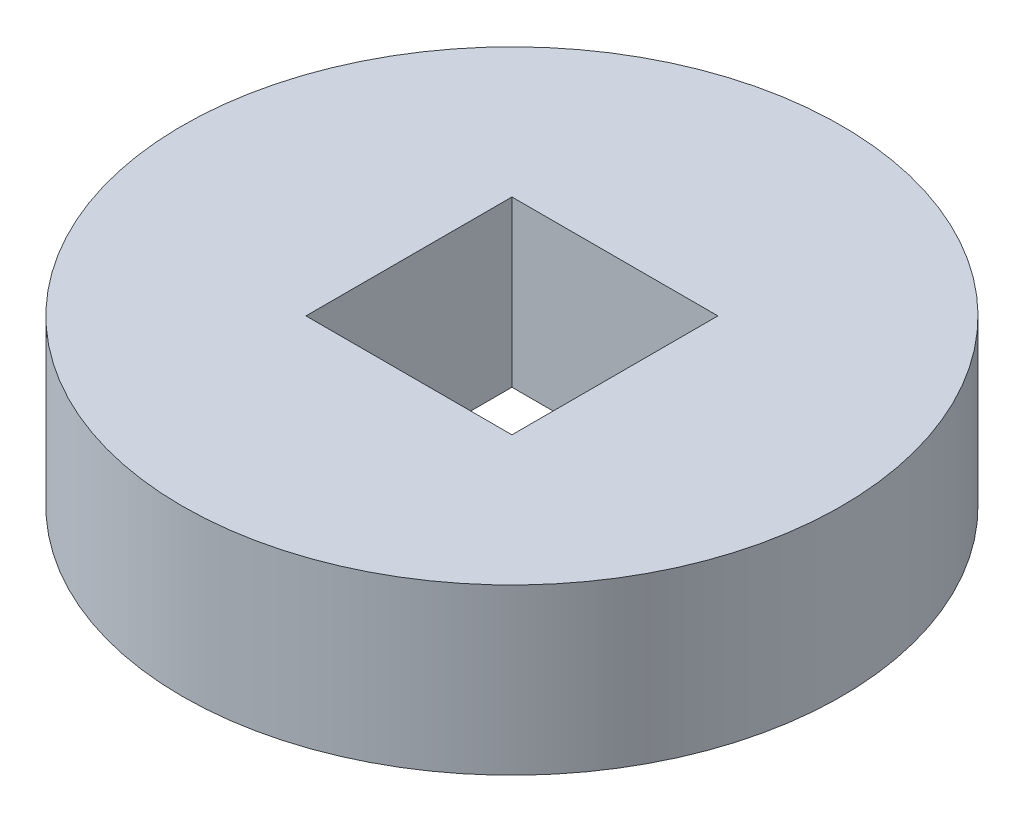
ISO-10303-21;
HEADER;
FILE_DESCRIPTION(('STEP AP214'),'2;1');
FILE_NAME('part.step','',(''),(''),'','','');
FILE_SCHEMA(('AUTOMOTIVE_DESIGN { 1 0 10303 214 1 1 1 1 }'));
ENDSEC;
DATA;
#1=APPLICATION_CONTEXT('core data for automotive mechanical design processes');
#2=APPLICATION_PROTOCOL_DEFINITION('international standard','automotive_design',2000,#1);
#3=PRODUCT_CONTEXT('',#1,'mechanical');
#4=PRODUCT('Part','Part','',(#3));
#5=PRODUCT_RELATED_PRODUCT_CATEGORY('part','',(#4));
#6=PRODUCT_DEFINITION_FORMATION('','',#4);
#7=PRODUCT_DEFINITION_CONTEXT('part definition',#1,'design');
#8=PRODUCT_DEFINITION('design','',#6,#7);
#9=PRODUCT_DEFINITION_SHAPE('','',#8);
#10=(LENGTH_UNIT() NAMED_UNIT(*) SI_UNIT(.MILLI.,.METRE.));
#11=(NAMED_UNIT(*) PLANE_ANGLE_UNIT() SI_UNIT($,.RADIAN.));
#12=(NAMED_UNIT(*) SI_UNIT($,.STERADIAN.) SOLID_ANGLE_UNIT());
#13=UNCERTAINTY_MEASURE_WITH_UNIT(LENGTH_MEASURE(1.E-05),#10,'distance_accuracy_value','');
#14=(GEOMETRIC_REPRESENTATION_CONTEXT(3) GLOBAL_UNCERTAINTY_ASSIGNED_CONTEXT((#13)) GLOBAL_UNIT_ASSIGNED_CONTEXT((#10,
#11,#12)) REPRESENTATION_CONTEXT('',''));
#15=CARTESIAN_POINT('',(0.,0.,0.));
#16=DIRECTION('',(0.,0.,1.));
#17=DIRECTION('',(1.,0.,0.));
#18=AXIS2_PLACEMENT_3D('',#15,#16,#17);
#19=CARTESIAN_POINT('',(0.,20.,0.));
#20=DIRECTION('',(0.,1.,0.));
#21=DIRECTION('',(0.,0.,1.));
#22=AXIS2_PLACEMENT_3D('',#19,#20,#21);
#23=PLANE('',#22);
#24=CARTESIAN_POINT('',(0.,20.,0.));
#25=DIRECTION('',(0.,1.,0.));
#26=DIRECTION('',(0.,0.,1.));
#27=AXIS2_PLACEMENT_3D('',#24,#25,#26);
#28=CIRCLE('',#27,40.);
#29=CARTESIAN_POINT('',(0.,20.,40.));
#30=VERTEX_POINT('',#29);
#31=EDGE_CURVE('E11',#30,#30,#28,.T.);
#32=ORIENTED_EDGE('',*,*,#31,.T.);
#33=EDGE_LOOP('',(#32));
#34=FACE_BOUND('',#33,.T.);
#35=DIRECTION('',(-1.,0.,0.));
#36=VECTOR('',#35,1.);
#37=CARTESIAN_POINT('',(-12.5,20.,-12.5));
#38=LINE('',#37,#36);
#39=CARTESIAN_POINT('',(12.5,20.,-12.5));
#40=VERTEX_POINT('',#39);
#41=CARTESIAN_POINT('',(-12.5,20.,-12.5));
#42=VERTEX_POINT('',#41);
#43=EDGE_CURVE('E88',#40,#42,#38,.T.);
#44=ORIENTED_EDGE('',*,*,#43,.F.);
#45=DIRECTION('',(0.,0.,-1.));
#46=VECTOR('',#45,1.);
#47=CARTESIAN_POINT('',(12.5,20.,12.5));
#48=LINE('',#47,#46);
#49=CARTESIAN_POINT('',(12.5,20.,12.5));
#50=VERTEX_POINT('',#49);
#51=EDGE_CURVE('E80',#50,#40,#48,.T.);
#52=ORIENTED_EDGE('',*,*,#51,.F.);
#53=DIRECTION('',(1.,0.,0.));
#54=VECTOR('',#53,1.);
#55=CARTESIAN_POINT('',(-12.5,20.,12.5));
#56=LINE('',#55,#54);
#57=CARTESIAN_POINT('',(-12.5,20.,12.5));
#58=VERTEX_POINT('',#57);
#59=EDGE_CURVE('E101',#58,#50,#56,.T.);
#60=ORIENTED_EDGE('',*,*,#59,.F.);
#61=DIRECTION('',(0.,0.,1.));
#62=VECTOR('',#61,1.);
#63=CARTESIAN_POINT('',(-12.5,20.,12.5));
#64=LINE('',#63,#62);
#65=EDGE_CURVE('E99',#42,#58,#64,.T.);
#66=ORIENTED_EDGE('',*,*,#65,.F.);
#67=EDGE_LOOP('',(#44,#52,#60,#66));
#68=FACE_BOUND('',#67,.T.);
#69=ADVANCED_FACE('F39',(#34,#68),#23,.T.);
#70=CARTESIAN_POINT('',(0.,0.,0.));
#71=DIRECTION('',(0.,1.,0.));
#72=DIRECTION('',(0.,0.,1.));
#73=AXIS2_PLACEMENT_3D('',#70,#71,#72);
#74=PLANE('',#73);
#75=CARTESIAN_POINT('',(0.,0.,0.));
#76=DIRECTION('',(0.,1.,0.));
#77=DIRECTION('',(0.,0.,1.));
#78=AXIS2_PLACEMENT_3D('',#75,#76,#77);
#79=CIRCLE('',#78,40.);
#80=CARTESIAN_POINT('',(0.,0.,40.));
#81=VERTEX_POINT('',#80);
#82=EDGE_CURVE('E43',#81,#81,#79,.T.);
#83=ORIENTED_EDGE('',*,*,#82,.F.);
#84=EDGE_LOOP('',(#83));
#85=FACE_BOUND('',#84,.T.);
#86=DIRECTION('',(0.,0.,-1.));
#87=VECTOR('',#86,1.);
#88=CARTESIAN_POINT('',(12.5,0.,12.5));
#89=LINE('',#88,#87);
#90=CARTESIAN_POINT('',(12.5,0.,12.5));
#91=VERTEX_POINT('',#90);
#92=CARTESIAN_POINT('',(12.5,0.,-12.5));
#93=VERTEX_POINT('',#92);
#94=EDGE_CURVE('E62',#91,#93,#89,.T.);
#95=ORIENTED_EDGE('',*,*,#94,.T.);
#96=DIRECTION('',(-1.,0.,0.));
#97=VECTOR('',#96,1.);
#98=CARTESIAN_POINT('',(-12.5,0.,-12.5));
#99=LINE('',#98,#97);
#100=CARTESIAN_POINT('',(-12.5,0.,-12.5));
#101=VERTEX_POINT('',#100);
#102=EDGE_CURVE('E95',#93,#101,#99,.T.);
#103=ORIENTED_EDGE('',*,*,#102,.T.);
#104=DIRECTION('',(0.,0.,1.));
#105=VECTOR('',#104,1.);
#106=CARTESIAN_POINT('',(-12.5,0.,12.5));
#107=LINE('',#106,#105);
#108=CARTESIAN_POINT('',(-12.5,0.,12.5));
#109=VERTEX_POINT('',#108);
#110=EDGE_CURVE('E107',#101,#109,#107,.T.);
#111=ORIENTED_EDGE('',*,*,#110,.T.);
#112=DIRECTION('',(1.,0.,0.));
#113=VECTOR('',#112,1.);
#114=CARTESIAN_POINT('',(-12.5,0.,12.5));
#115=LINE('',#114,#113);
#116=EDGE_CURVE('E89',#109,#91,#115,.T.);
#117=ORIENTED_EDGE('',*,*,#116,.T.);
#118=EDGE_LOOP('',(#95,#103,#111,#117));
#119=FACE_BOUND('',#118,.T.);
#120=ADVANCED_FACE('F118',(#85,#119),#74,.F.);
#121=CARTESIAN_POINT('',(0.,20.,0.));
#122=DIRECTION('',(0.,-1.,0.));
#123=DIRECTION('',(0.,0.,-1.));
#124=AXIS2_PLACEMENT_3D('',#121,#122,#123);
#125=CYLINDRICAL_SURFACE('',#124,40.);
#126=ORIENTED_EDGE('',*,*,#31,.F.);
#127=EDGE_LOOP('',(#126));
#128=FACE_BOUND('',#127,.T.);
#129=ORIENTED_EDGE('',*,*,#82,.T.);
#130=EDGE_LOOP('',(#129));
#131=FACE_BOUND('',#130,.T.);
#132=ADVANCED_FACE('F41',(#128,#131),#125,.T.);
#133=CARTESIAN_POINT('',(12.5,20.,12.5));
#134=DIRECTION('',(-1.,0.,0.));
#135=DIRECTION('',(0.,0.,1.));
#136=AXIS2_PLACEMENT_3D('',#133,#134,#135);
#137=PLANE('',#136);
#138=ORIENTED_EDGE('',*,*,#94,.F.);
#139=DIRECTION('',(0.,-1.,0.));
#140=VECTOR('',#139,1.);
#141=CARTESIAN_POINT('',(12.5,20.,12.5));
#142=LINE('',#141,#140);
#143=EDGE_CURVE('E84',#50,#91,#142,.T.);
#144=ORIENTED_EDGE('',*,*,#143,.F.);
#145=ORIENTED_EDGE('',*,*,#51,.T.);
#146=DIRECTION('',(0.,-1.,0.));
#147=VECTOR('',#146,1.);
#148=CARTESIAN_POINT('',(12.5,20.,-12.5));
#149=LINE('',#148,#147);
#150=EDGE_CURVE('E83',#40,#93,#149,.T.);
#151=ORIENTED_EDGE('',*,*,#150,.T.);
#152=EDGE_LOOP('',(#138,#144,#145,#151));
#153=FACE_BOUND('',#152,.T.);
#154=ADVANCED_FACE('F82',(#153),#137,.T.);
#155=CARTESIAN_POINT('',(-12.5,20.,-12.5));
#156=DIRECTION('',(0.,0.,1.));
#157=DIRECTION('',(1.,0.,0.));
#158=AXIS2_PLACEMENT_3D('',#155,#156,#157);
#159=PLANE('',#158);
#160=ORIENTED_EDGE('',*,*,#102,.F.);
#161=ORIENTED_EDGE('',*,*,#150,.F.);
#162=ORIENTED_EDGE('',*,*,#43,.T.);
#163=DIRECTION('',(0.,-1.,0.));
#164=VECTOR('',#163,1.);
#165=CARTESIAN_POINT('',(-12.5,20.,-12.5));
#166=LINE('',#165,#164);
#167=EDGE_CURVE('E96',#42,#101,#166,.T.);
#168=ORIENTED_EDGE('',*,*,#167,.T.);
#169=EDGE_LOOP('',(#160,#161,#162,#168));
#170=FACE_BOUND('',#169,.T.);
#171=ADVANCED_FACE('F92',(#170),#159,.T.);
#172=CARTESIAN_POINT('',(-12.5,20.,12.5));
#173=DIRECTION('',(1.,0.,0.));
#174=DIRECTION('',(0.,0.,-1.));
#175=AXIS2_PLACEMENT_3D('',#172,#173,#174);
#176=PLANE('',#175);
#177=ORIENTED_EDGE('',*,*,#110,.F.);
#178=ORIENTED_EDGE('',*,*,#167,.F.);
#179=ORIENTED_EDGE('',*,*,#65,.T.);
#180=DIRECTION('',(0.,-1.,0.));
#181=VECTOR('',#180,1.);
#182=CARTESIAN_POINT('',(-12.5,20.,12.5));
#183=LINE('',#182,#181);
#184=EDGE_CURVE('E54',#58,#109,#183,.T.);
#185=ORIENTED_EDGE('',*,*,#184,.T.);
#186=EDGE_LOOP('',(#177,#178,#179,#185));
#187=FACE_BOUND('',#186,.T.);
#188=ADVANCED_FACE('F116',(#187),#176,.T.);
#189=CARTESIAN_POINT('',(-12.5,20.,12.5));
#190=DIRECTION('',(0.,0.,-1.));
#191=DIRECTION('',(-1.,0.,0.));
#192=AXIS2_PLACEMENT_3D('',#189,#190,#191);
#193=PLANE('',#192);
#194=ORIENTED_EDGE('',*,*,#116,.F.);
#195=ORIENTED_EDGE('',*,*,#184,.F.);
#196=ORIENTED_EDGE('',*,*,#59,.T.);
#197=ORIENTED_EDGE('',*,*,#143,.T.);
#198=EDGE_LOOP('',(#194,#195,#196,#197));
#199=FACE_BOUND('',#198,.T.);
#200=ADVANCED_FACE('F119',(#199),#193,.T.);
#201=CLOSED_SHELL('',(#69,#120,#132,#154,#171,#188,#200));
#202=MANIFOLD_SOLID_BREP('B2',#201);
#203=ADVANCED_BREP_SHAPE_REPRESENTATION('',(#18,#202),#14);
#204=SHAPE_DEFINITION_REPRESENTATION(#9,#203);
ENDSEC;
END-ISO-10303-21;
